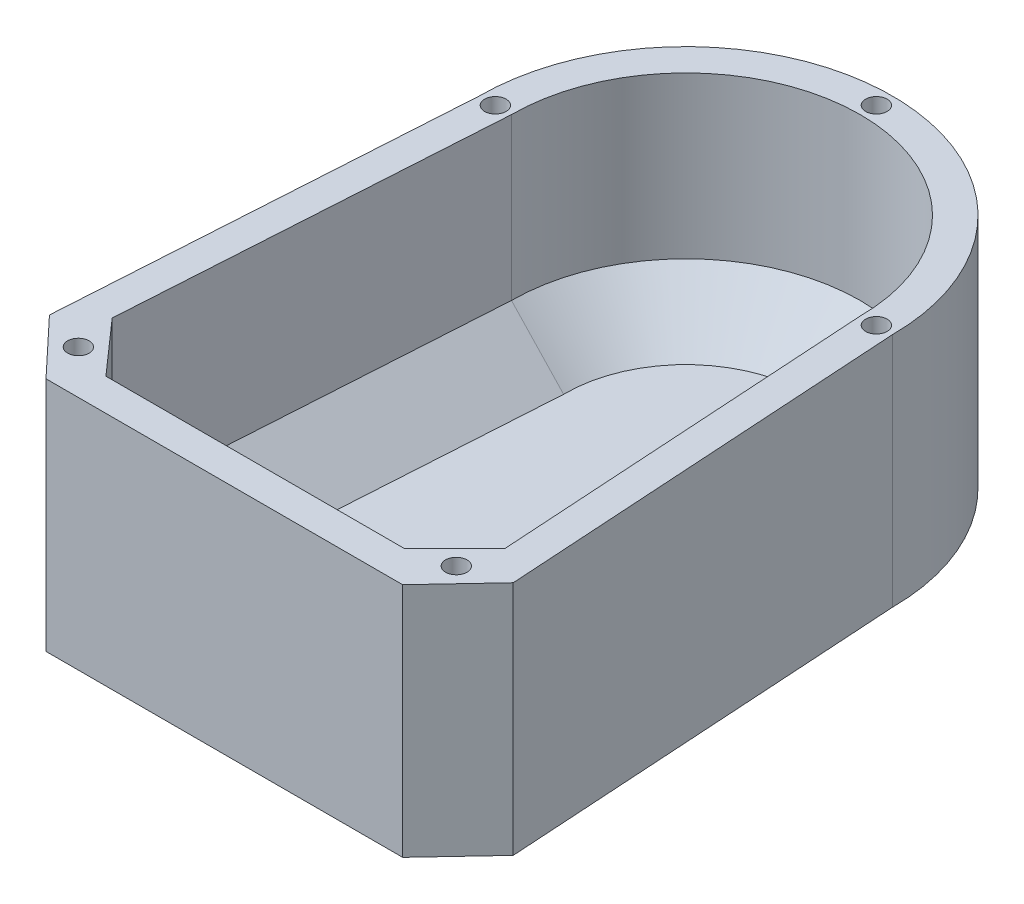
ISO-10303-21;
HEADER;
FILE_DESCRIPTION(('STEP AP214'),'2;1');
FILE_NAME('part.step','',(''),(''),'','','');
FILE_SCHEMA(('AUTOMOTIVE_DESIGN { 1 0 10303 214 1 1 1 1 }'));
ENDSEC;
DATA;
#1=APPLICATION_CONTEXT('core data for automotive mechanical design processes');
#2=APPLICATION_PROTOCOL_DEFINITION('international standard','automotive_design',2000,#1);
#3=PRODUCT_CONTEXT('',#1,'mechanical');
#4=PRODUCT('Part','Part','',(#3));
#5=PRODUCT_RELATED_PRODUCT_CATEGORY('part','',(#4));
#6=PRODUCT_DEFINITION_FORMATION('','',#4);
#7=PRODUCT_DEFINITION_CONTEXT('part definition',#1,'design');
#8=PRODUCT_DEFINITION('design','',#6,#7);
#9=PRODUCT_DEFINITION_SHAPE('','',#8);
#10=(LENGTH_UNIT() NAMED_UNIT(*) SI_UNIT(.MILLI.,.METRE.));
#11=(NAMED_UNIT(*) PLANE_ANGLE_UNIT() SI_UNIT($,.RADIAN.));
#12=(NAMED_UNIT(*) SI_UNIT($,.STERADIAN.) SOLID_ANGLE_UNIT());
#13=UNCERTAINTY_MEASURE_WITH_UNIT(LENGTH_MEASURE(1.E-05),#10,'distance_accuracy_value','');
#14=(GEOMETRIC_REPRESENTATION_CONTEXT(3) GLOBAL_UNCERTAINTY_ASSIGNED_CONTEXT((#13)) GLOBAL_UNIT_ASSIGNED_CONTEXT((#10,
#11,#12)) REPRESENTATION_CONTEXT('',''));
#15=CARTESIAN_POINT('',(0.,0.,0.));
#16=DIRECTION('',(0.,0.,1.));
#17=DIRECTION('',(1.,0.,0.));
#18=AXIS2_PLACEMENT_3D('',#15,#16,#17);
#19=CARTESIAN_POINT('',(0.,4.,0.));
#20=DIRECTION('',(0.,1.,0.));
#21=DIRECTION('',(0.,0.,1.));
#22=AXIS2_PLACEMENT_3D('',#19,#20,#21);
#23=PLANE('',#22);
#24=DIRECTION('',(1.,0.,0.));
#25=VECTOR('',#24,1.);
#26=CARTESIAN_POINT('',(0.,4.,70.));
#27=LINE('',#26,#25);
#28=CARTESIAN_POINT('',(-26.8554877863241,4.,70.));
#29=VERTEX_POINT('',#28);
#30=CARTESIAN_POINT('',(26.8554877863241,4.,70.));
#31=VERTEX_POINT('',#30);
#32=EDGE_CURVE('E212',#29,#31,#27,.T.);
#33=ORIENTED_EDGE('',*,*,#32,.T.);
#34=DIRECTION('',(-0.0623782861551806,0.,-0.998052578482889));
#35=VECTOR('',#34,1.);
#36=CARTESIAN_POINT('',(22.3930150712022,4.,-1.39956344195014));
#37=LINE('',#36,#35);
#38=CARTESIAN_POINT('',(22.498212646903,4.,0.283597769262948));
#39=VERTEX_POINT('',#38);
#40=EDGE_CURVE('E214',#31,#39,#37,.T.);
#41=ORIENTED_EDGE('',*,*,#40,.T.);
#42=CARTESIAN_POINT('',(0.,4.,0.));
#43=DIRECTION('',(0.,1.,0.));
#44=DIRECTION('',(0.,0.,1.));
#45=AXIS2_PLACEMENT_3D('',#42,#43,#44);
#46=CIRCLE('',#45,22.5);
#47=CARTESIAN_POINT('',(-22.498212646903,4.,0.283597769262998));
#48=VERTEX_POINT('',#47);
#49=EDGE_CURVE('E206',#39,#48,#46,.T.);
#50=ORIENTED_EDGE('',*,*,#49,.T.);
#51=DIRECTION('',(-0.0623782861551804,0.,0.998052578482889));
#52=VECTOR('',#51,1.);
#53=CARTESIAN_POINT('',(-22.3930150712022,4.,-1.39956344195013));
#54=LINE('',#53,#52);
#55=EDGE_CURVE('E210',#48,#29,#54,.T.);
#56=ORIENTED_EDGE('',*,*,#55,.T.);
#57=EDGE_LOOP('',(#33,#41,#50,#56));
#58=FACE_BOUND('',#57,.T.);
#59=ADVANCED_FACE('F39',(#58),#23,.T.);
#60=CARTESIAN_POINT('',(-38.5,0.,0.));
#61=DIRECTION('',(-0.998052578482888,0.,-0.0623782861551804));
#62=DIRECTION('',(-0.0623782861551804,0.,0.998052578482889));
#63=AXIS2_PLACEMENT_3D('',#60,#61,#62);
#64=PLANE('',#63);
#65=DIRECTION('',(-0.0623782861551804,0.,0.998052578482889));
#66=VECTOR('',#65,1.);
#67=CARTESIAN_POINT('',(-38.5,0.,0.));
#68=LINE('',#67,#66);
#69=CARTESIAN_POINT('',(-38.5,0.,0.));
#70=VERTEX_POINT('',#69);
#71=CARTESIAN_POINT('',(-43.211013571153,0.,75.3762171384481));
#72=VERTEX_POINT('',#71);
#73=EDGE_CURVE('E191',#70,#72,#68,.T.);
#74=ORIENTED_EDGE('',*,*,#73,.T.);
#75=DIRECTION('',(0.,1.,0.));
#76=VECTOR('',#75,1.);
#77=CARTESIAN_POINT('',(-43.211013571153,0.,75.3762171384481));
#78=LINE('',#77,#76);
#79=CARTESIAN_POINT('',(-43.211013571153,44.,75.3762171384481));
#80=VERTEX_POINT('',#79);
#81=EDGE_CURVE('E284',#72,#80,#78,.T.);
#82=ORIENTED_EDGE('',*,*,#81,.T.);
#83=DIRECTION('',(-0.0623782861551804,0.,0.998052578482889));
#84=VECTOR('',#83,1.);
#85=CARTESIAN_POINT('',(-38.5,44.,0.));
#86=LINE('',#85,#84);
#87=CARTESIAN_POINT('',(-38.5,44.,0.));
#88=VERTEX_POINT('',#87);
#89=EDGE_CURVE('E181',#88,#80,#86,.T.);
#90=ORIENTED_EDGE('',*,*,#89,.F.);
#91=DIRECTION('',(0.,1.,0.));
#92=VECTOR('',#91,1.);
#93=CARTESIAN_POINT('',(-38.5,0.,0.));
#94=LINE('',#93,#92);
#95=EDGE_CURVE('E204',#70,#88,#94,.T.);
#96=ORIENTED_EDGE('',*,*,#95,.F.);
#97=EDGE_LOOP('',(#74,#82,#90,#96));
#98=FACE_BOUND('',#97,.T.);
#99=ADVANCED_FACE('F323',(#98),#64,.T.);
#100=CARTESIAN_POINT('',(0.,0.,0.));
#101=DIRECTION('',(0.,1.,0.));
#102=DIRECTION('',(0.,0.,1.));
#103=AXIS2_PLACEMENT_3D('',#100,#101,#102);
#104=CYLINDRICAL_SURFACE('',#103,38.5);
#105=ORIENTED_EDGE('',*,*,#95,.T.);
#106=CARTESIAN_POINT('',(0.,44.,0.));
#107=DIRECTION('',(0.,1.,0.));
#108=DIRECTION('',(0.,0.,1.));
#109=AXIS2_PLACEMENT_3D('',#106,#107,#108);
#110=CIRCLE('',#109,38.5);
#111=CARTESIAN_POINT('',(38.5,44.,0.));
#112=VERTEX_POINT('',#111);
#113=EDGE_CURVE('E160',#112,#88,#110,.T.);
#114=ORIENTED_EDGE('',*,*,#113,.F.);
#115=DIRECTION('',(0.,1.,0.));
#116=VECTOR('',#115,1.);
#117=CARTESIAN_POINT('',(38.5,0.,0.));
#118=LINE('',#117,#116);
#119=CARTESIAN_POINT('',(38.5,0.,0.));
#120=VERTEX_POINT('',#119);
#121=EDGE_CURVE('E203',#120,#112,#118,.T.);
#122=ORIENTED_EDGE('',*,*,#121,.F.);
#123=CARTESIAN_POINT('',(0.,0.,0.));
#124=DIRECTION('',(0.,1.,0.));
#125=DIRECTION('',(0.,0.,1.));
#126=AXIS2_PLACEMENT_3D('',#123,#124,#125);
#127=CIRCLE('',#126,38.5);
#128=EDGE_CURVE('E200',#120,#70,#127,.T.);
#129=ORIENTED_EDGE('',*,*,#128,.T.);
#130=EDGE_LOOP('',(#105,#114,#122,#129));
#131=FACE_BOUND('',#130,.T.);
#132=ADVANCED_FACE('F329',(#131),#104,.T.);
#133=CARTESIAN_POINT('',(43.5,0.,80.));
#134=DIRECTION('',(0.998052578482888,0.,-0.0623782861551807));
#135=DIRECTION('',(-0.0623782861551807,0.,-0.998052578482889));
#136=AXIS2_PLACEMENT_3D('',#133,#134,#135);
#137=PLANE('',#136);
#138=DIRECTION('',(-0.0623782861551807,0.,-0.998052578482889));
#139=VECTOR('',#138,1.);
#140=CARTESIAN_POINT('',(43.5,44.,80.));
#141=LINE('',#140,#139);
#142=CARTESIAN_POINT('',(43.211013571153,44.,75.3762171384481));
#143=VERTEX_POINT('',#142);
#144=EDGE_CURVE('E187',#143,#112,#141,.T.);
#145=ORIENTED_EDGE('',*,*,#144,.F.);
#146=DIRECTION('',(0.,-1.,0.));
#147=VECTOR('',#146,1.);
#148=CARTESIAN_POINT('',(43.211013571153,0.,75.3762171384481));
#149=LINE('',#148,#147);
#150=CARTESIAN_POINT('',(43.211013571153,0.,75.3762171384481));
#151=VERTEX_POINT('',#150);
#152=EDGE_CURVE('E278',#143,#151,#149,.T.);
#153=ORIENTED_EDGE('',*,*,#152,.T.);
#154=DIRECTION('',(-0.0623782861551807,0.,-0.998052578482889));
#155=VECTOR('',#154,1.);
#156=CARTESIAN_POINT('',(43.5,0.,80.));
#157=LINE('',#156,#155);
#158=EDGE_CURVE('E198',#151,#120,#157,.T.);
#159=ORIENTED_EDGE('',*,*,#158,.T.);
#160=ORIENTED_EDGE('',*,*,#121,.T.);
#161=EDGE_LOOP('',(#145,#153,#159,#160));
#162=FACE_BOUND('',#161,.T.);
#163=ADVANCED_FACE('F362',(#162),#137,.T.);
#164=CARTESIAN_POINT('',(-43.5,0.,86.));
#165=DIRECTION('',(0.,0.,1.));
#166=DIRECTION('',(1.,0.,0.));
#167=AXIS2_PLACEMENT_3D('',#164,#165,#166);
#168=PLANE('',#167);
#169=DIRECTION('',(1.,0.,0.));
#170=VECTOR('',#169,1.);
#171=CARTESIAN_POINT('',(-43.5,0.,86.));
#172=LINE('',#171,#170);
#173=CARTESIAN_POINT('',(-33.2304877863241,0.,86.));
#174=VERTEX_POINT('',#173);
#175=CARTESIAN_POINT('',(33.230487786324,0.,86.));
#176=VERTEX_POINT('',#175);
#177=EDGE_CURVE('E195',#174,#176,#172,.T.);
#178=ORIENTED_EDGE('',*,*,#177,.T.);
#179=DIRECTION('',(0.,1.,0.));
#180=VECTOR('',#179,1.);
#181=CARTESIAN_POINT('',(33.230487786324,0.,86.));
#182=LINE('',#181,#180);
#183=CARTESIAN_POINT('',(33.230487786324,44.,86.));
#184=VERTEX_POINT('',#183);
#185=EDGE_CURVE('E271',#176,#184,#182,.T.);
#186=ORIENTED_EDGE('',*,*,#185,.T.);
#187=DIRECTION('',(1.,0.,0.));
#188=VECTOR('',#187,1.);
#189=CARTESIAN_POINT('',(-43.5,44.,86.));
#190=LINE('',#189,#188);
#191=CARTESIAN_POINT('',(-33.2304877863241,44.,86.));
#192=VERTEX_POINT('',#191);
#193=EDGE_CURVE('E184',#192,#184,#190,.T.);
#194=ORIENTED_EDGE('',*,*,#193,.F.);
#195=DIRECTION('',(0.,-1.,0.));
#196=VECTOR('',#195,1.);
#197=CARTESIAN_POINT('',(-33.2304877863241,0.,86.));
#198=LINE('',#197,#196);
#199=EDGE_CURVE('E225',#192,#174,#198,.T.);
#200=ORIENTED_EDGE('',*,*,#199,.T.);
#201=EDGE_LOOP('',(#178,#186,#194,#200));
#202=FACE_BOUND('',#201,.T.);
#203=ADVANCED_FACE('F352',(#202),#168,.T.);
#204=CARTESIAN_POINT('',(0.,0.,0.));
#205=DIRECTION('',(0.,1.,0.));
#206=DIRECTION('',(0.,0.,1.));
#207=AXIS2_PLACEMENT_3D('',#204,#205,#206);
#208=CYLINDRICAL_SURFACE('',#207,32.5);
#209=DIRECTION('',(0.,1.,0.));
#210=VECTOR('',#209,1.);
#211=CARTESIAN_POINT('',(-32.5,0.,0.));
#212=LINE('',#211,#210);
#213=CARTESIAN_POINT('',(-32.5,14.,0.));
#214=VERTEX_POINT('',#213);
#215=CARTESIAN_POINT('',(-32.5,44.,0.));
#216=VERTEX_POINT('',#215);
#217=EDGE_CURVE('E149',#214,#216,#212,.T.);
#218=ORIENTED_EDGE('',*,*,#217,.F.);
#219=CARTESIAN_POINT('',(0.,14.,0.));
#220=DIRECTION('',(0.,1.,0.));
#221=DIRECTION('',(0.,0.,1.));
#222=AXIS2_PLACEMENT_3D('',#219,#220,#221);
#223=CIRCLE('',#222,32.5);
#224=CARTESIAN_POINT('',(32.5,14.,0.));
#225=VERTEX_POINT('',#224);
#226=EDGE_CURVE('E223',#214,#225,#223,.F.);
#227=ORIENTED_EDGE('',*,*,#226,.T.);
#228=DIRECTION('',(0.,1.,0.));
#229=VECTOR('',#228,1.);
#230=CARTESIAN_POINT('',(32.5,0.,0.));
#231=LINE('',#230,#229);
#232=CARTESIAN_POINT('',(32.5,44.,0.));
#233=VERTEX_POINT('',#232);
#234=EDGE_CURVE('E159',#225,#233,#231,.T.);
#235=ORIENTED_EDGE('',*,*,#234,.T.);
#236=CARTESIAN_POINT('',(0.,44.,0.));
#237=DIRECTION('',(0.,1.,0.));
#238=DIRECTION('',(0.,0.,1.));
#239=AXIS2_PLACEMENT_3D('',#236,#237,#238);
#240=CIRCLE('',#239,32.5);
#241=EDGE_CURVE('E164',#233,#216,#240,.T.);
#242=ORIENTED_EDGE('',*,*,#241,.T.);
#243=EDGE_LOOP('',(#218,#227,#235,#242));
#244=FACE_BOUND('',#243,.T.);
#245=ADVANCED_FACE('F165',(#244),#208,.F.);
#246=CARTESIAN_POINT('',(37.5,0.,80.));
#247=DIRECTION('',(0.998052578482888,0.,-0.0623782861551806));
#248=DIRECTION('',(-0.0623782861551806,0.,-0.998052578482889));
#249=AXIS2_PLACEMENT_3D('',#246,#247,#248);
#250=PLANE('',#249);
#251=DIRECTION('',(0.0623782861551806,0.,0.998052578482889));
#252=VECTOR('',#251,1.);
#253=CARTESIAN_POINT('',(37.5,14.,80.));
#254=LINE('',#253,#252);
#255=CARTESIAN_POINT('',(36.9117647058824,14.,70.5882352941176));
#256=VERTEX_POINT('',#255);
#257=EDGE_CURVE('E217',#225,#256,#254,.T.);
#258=ORIENTED_EDGE('',*,*,#257,.T.);
#259=DIRECTION('',(0.,1.,0.));
#260=VECTOR('',#259,1.);
#261=CARTESIAN_POINT('',(36.9117647058824,44.,70.5882352941176));
#262=LINE('',#261,#260);
#263=CARTESIAN_POINT('',(36.9117647058824,44.,70.5882352941176));
#264=VERTEX_POINT('',#263);
#265=EDGE_CURVE('E299',#256,#264,#262,.T.);
#266=ORIENTED_EDGE('',*,*,#265,.T.);
#267=DIRECTION('',(-0.0623782861551806,0.,-0.998052578482889));
#268=VECTOR('',#267,1.);
#269=CARTESIAN_POINT('',(37.5,44.,80.));
#270=LINE('',#269,#268);
#271=EDGE_CURVE('E176',#264,#233,#270,.T.);
#272=ORIENTED_EDGE('',*,*,#271,.T.);
#273=ORIENTED_EDGE('',*,*,#234,.F.);
#274=EDGE_LOOP('',(#258,#266,#272,#273));
#275=FACE_BOUND('',#274,.T.);
#276=ADVANCED_FACE('F304',(#275),#250,.F.);
#277=CARTESIAN_POINT('',(-37.5,0.,80.));
#278=DIRECTION('',(0.,0.,1.));
#279=DIRECTION('',(1.,0.,0.));
#280=AXIS2_PLACEMENT_3D('',#277,#278,#279);
#281=PLANE('',#280);
#282=DIRECTION('',(-1.,0.,0.));
#283=VECTOR('',#282,1.);
#284=CARTESIAN_POINT('',(-37.5,14.,80.));
#285=LINE('',#284,#283);
#286=CARTESIAN_POINT('',(27.5,14.,80.));
#287=VERTEX_POINT('',#286);
#288=CARTESIAN_POINT('',(-28.0698708577168,14.,80.));
#289=VERTEX_POINT('',#288);
#290=EDGE_CURVE('E219',#287,#289,#285,.T.);
#291=ORIENTED_EDGE('',*,*,#290,.T.);
#292=DIRECTION('',(0.,1.,0.));
#293=VECTOR('',#292,1.);
#294=CARTESIAN_POINT('',(-28.0698708577168,44.,80.));
#295=LINE('',#294,#293);
#296=CARTESIAN_POINT('',(-28.0698708577168,44.,80.));
#297=VERTEX_POINT('',#296);
#298=EDGE_CURVE('E289',#289,#297,#295,.T.);
#299=ORIENTED_EDGE('',*,*,#298,.T.);
#300=DIRECTION('',(1.,0.,0.));
#301=VECTOR('',#300,1.);
#302=CARTESIAN_POINT('',(-37.5,44.,80.));
#303=LINE('',#302,#301);
#304=CARTESIAN_POINT('',(27.5,44.,80.));
#305=VERTEX_POINT('',#304);
#306=EDGE_CURVE('E173',#297,#305,#303,.T.);
#307=ORIENTED_EDGE('',*,*,#306,.T.);
#308=DIRECTION('',(0.,-1.,0.));
#309=VECTOR('',#308,1.);
#310=CARTESIAN_POINT('',(27.5,14.,80.));
#311=LINE('',#310,#309);
#312=EDGE_CURVE('E287',#305,#287,#311,.T.);
#313=ORIENTED_EDGE('',*,*,#312,.T.);
#314=EDGE_LOOP('',(#291,#299,#307,#313));
#315=FACE_BOUND('',#314,.T.);
#316=ADVANCED_FACE('F308',(#315),#281,.F.);
#317=CARTESIAN_POINT('',(-32.5,0.,0.));
#318=DIRECTION('',(-0.998052578482888,0.,-0.0623782861551804));
#319=DIRECTION('',(-0.0623782861551804,0.,0.998052578482889));
#320=AXIS2_PLACEMENT_3D('',#317,#318,#319);
#321=PLANE('',#320);
#322=DIRECTION('',(-0.0623782861551804,0.,0.998052578482889));
#323=VECTOR('',#322,1.);
#324=CARTESIAN_POINT('',(-32.5,44.,0.));
#325=LINE('',#324,#323);
#326=CARTESIAN_POINT('',(-36.8762171384482,44.,70.0194742151712));
#327=VERTEX_POINT('',#326);
#328=EDGE_CURVE('E153',#216,#327,#325,.T.);
#329=ORIENTED_EDGE('',*,*,#328,.T.);
#330=DIRECTION('',(0.,-1.,0.));
#331=VECTOR('',#330,1.);
#332=CARTESIAN_POINT('',(-36.8762171384482,14.,70.0194742151712));
#333=LINE('',#332,#331);
#334=CARTESIAN_POINT('',(-36.8762171384482,14.,70.0194742151712));
#335=VERTEX_POINT('',#334);
#336=EDGE_CURVE('E292',#327,#335,#333,.T.);
#337=ORIENTED_EDGE('',*,*,#336,.T.);
#338=DIRECTION('',(0.0623782861551804,0.,-0.998052578482889));
#339=VECTOR('',#338,1.);
#340=CARTESIAN_POINT('',(-32.5,14.,0.));
#341=LINE('',#340,#339);
#342=EDGE_CURVE('E156',#335,#214,#341,.T.);
#343=ORIENTED_EDGE('',*,*,#342,.T.);
#344=ORIENTED_EDGE('',*,*,#217,.T.);
#345=EDGE_LOOP('',(#329,#337,#343,#344));
#346=FACE_BOUND('',#345,.T.);
#347=ADVANCED_FACE('F151',(#346),#321,.F.);
#348=CARTESIAN_POINT('',(0.,44.,0.));
#349=DIRECTION('',(0.,1.,0.));
#350=DIRECTION('',(0.,0.,1.));
#351=AXIS2_PLACEMENT_3D('',#348,#349,#350);
#352=PLANE('',#351);
#353=CARTESIAN_POINT('',(0.,44.,-35.5));
#354=DIRECTION('',(0.,1.,0.));
#355=DIRECTION('',(0.,0.,1.));
#356=AXIS2_PLACEMENT_3D('',#353,#354,#355);
#357=CIRCLE('',#356,2.);
#358=CARTESIAN_POINT('',(0.,44.,-33.5));
#359=VERTEX_POINT('',#358);
#360=EDGE_CURVE('E417',#359,#359,#357,.T.);
#361=ORIENTED_EDGE('',*,*,#360,.F.);
#362=EDGE_LOOP('',(#361));
#363=FACE_BOUND('',#362,.T.);
#364=CARTESIAN_POINT('',(-35.5,44.,0.));
#365=DIRECTION('',(0.,1.,0.));
#366=DIRECTION('',(0.,0.,1.));
#367=AXIS2_PLACEMENT_3D('',#364,#365,#366);
#368=CIRCLE('',#367,2.);
#369=CARTESIAN_POINT('',(-35.5,44.,2.));
#370=VERTEX_POINT('',#369);
#371=EDGE_CURVE('E420',#370,#370,#368,.T.);
#372=ORIENTED_EDGE('',*,*,#371,.F.);
#373=EDGE_LOOP('',(#372));
#374=FACE_BOUND('',#373,.T.);
#375=CARTESIAN_POINT('',(-35.3468973384105,44.,77.8489228384048));
#376=DIRECTION('',(0.,1.,0.));
#377=DIRECTION('',(0.,0.,1.));
#378=AXIS2_PLACEMENT_3D('',#375,#376,#377);
#379=CIRCLE('',#378,2.);
#380=CARTESIAN_POINT('',(-35.3468973384105,44.,79.8489228384048));
#381=VERTEX_POINT('',#380);
#382=EDGE_CURVE('E428',#381,#381,#379,.T.);
#383=ORIENTED_EDGE('',*,*,#382,.F.);
#384=EDGE_LOOP('',(#383));
#385=FACE_BOUND('',#384,.T.);
#386=CARTESIAN_POINT('',(35.2133165158398,44.,77.9911131081414));
#387=DIRECTION('',(0.,1.,0.));
#388=DIRECTION('',(0.,0.,1.));
#389=AXIS2_PLACEMENT_3D('',#386,#387,#388);
#390=CIRCLE('',#389,2.);
#391=CARTESIAN_POINT('',(35.2133165158398,44.,79.9911131081414));
#392=VERTEX_POINT('',#391);
#393=EDGE_CURVE('E434',#392,#392,#390,.T.);
#394=ORIENTED_EDGE('',*,*,#393,.F.);
#395=EDGE_LOOP('',(#394));
#396=FACE_BOUND('',#395,.T.);
#397=CARTESIAN_POINT('',(35.5,44.,0.));
#398=DIRECTION('',(0.,1.,0.));
#399=DIRECTION('',(0.,0.,1.));
#400=AXIS2_PLACEMENT_3D('',#397,#398,#399);
#401=CIRCLE('',#400,2.);
#402=CARTESIAN_POINT('',(35.5,44.,2.));
#403=VERTEX_POINT('',#402);
#404=EDGE_CURVE('E440',#403,#403,#401,.T.);
#405=ORIENTED_EDGE('',*,*,#404,.F.);
#406=EDGE_LOOP('',(#405));
#407=FACE_BOUND('',#406,.T.);
#408=ORIENTED_EDGE('',*,*,#193,.T.);
#409=DIRECTION('',(-0.684697639051293,0.,0.728827238155645));
#410=VECTOR('',#409,1.);
#411=CARTESIAN_POINT('',(60.5679352060318,44.,56.90062070502));
#412=LINE('',#411,#410);
#413=EDGE_CURVE('E276',#184,#143,#412,.F.);
#414=ORIENTED_EDGE('',*,*,#413,.T.);
#415=ORIENTED_EDGE('',*,*,#144,.T.);
#416=ORIENTED_EDGE('',*,*,#113,.T.);
#417=ORIENTED_EDGE('',*,*,#89,.T.);
#418=DIRECTION('',(-0.684697639051286,0.,-0.728827238155652));
#419=VECTOR('',#418,1.);
#420=CARTESIAN_POINT('',(-60.5679352060322,44.,56.9006207050192));
#421=LINE('',#420,#419);
#422=EDGE_CURVE('E274',#80,#192,#421,.F.);
#423=ORIENTED_EDGE('',*,*,#422,.T.);
#424=EDGE_LOOP('',(#408,#414,#415,#416,#417,#423));
#425=FACE_BOUND('',#424,.T.);
#426=ORIENTED_EDGE('',*,*,#328,.F.);
#427=ORIENTED_EDGE('',*,*,#241,.F.);
#428=ORIENTED_EDGE('',*,*,#271,.F.);
#429=DIRECTION('',(0.707106781186544,0.,-0.707106781186551));
#430=VECTOR('',#429,1.);
#431=CARTESIAN_POINT('',(36.9117647058824,44.,70.5882352941176));
#432=LINE('',#431,#430);
#433=EDGE_CURVE('E11',#264,#305,#432,.F.);
#434=ORIENTED_EDGE('',*,*,#433,.T.);
#435=ORIENTED_EDGE('',*,*,#306,.F.);
#436=DIRECTION('',(0.661621637086851,0.,0.749837855365089));
#437=VECTOR('',#436,1.);
#438=CARTESIAN_POINT('',(-28.0698708577168,44.,80.));
#439=LINE('',#438,#437);
#440=EDGE_CURVE('E48',#297,#327,#439,.F.);
#441=ORIENTED_EDGE('',*,*,#440,.T.);
#442=EDGE_LOOP('',(#426,#427,#428,#434,#435,#441));
#443=FACE_BOUND('',#442,.T.);
#444=ADVANCED_FACE('F171',(#363,#374,#385,#396,#407,#425,#443),#352,.T.);
#445=CARTESIAN_POINT('',(0.,0.,0.));
#446=DIRECTION('',(0.,1.,0.));
#447=DIRECTION('',(0.,0.,1.));
#448=AXIS2_PLACEMENT_3D('',#445,#446,#447);
#449=PLANE('',#448);
#450=ORIENTED_EDGE('',*,*,#158,.F.);
#451=DIRECTION('',(0.684697639051293,0.,-0.728827238155645));
#452=VECTOR('',#451,1.);
#453=CARTESIAN_POINT('',(33.230487786324,0.,86.));
#454=LINE('',#453,#452);
#455=EDGE_CURVE('E282',#151,#176,#454,.F.);
#456=ORIENTED_EDGE('',*,*,#455,.T.);
#457=ORIENTED_EDGE('',*,*,#177,.F.);
#458=DIRECTION('',(0.684697639051286,0.,0.728827238155652));
#459=VECTOR('',#458,1.);
#460=CARTESIAN_POINT('',(-43.211013571153,0.,75.376217138448));
#461=LINE('',#460,#459);
#462=EDGE_CURVE('E280',#174,#72,#461,.F.);
#463=ORIENTED_EDGE('',*,*,#462,.T.);
#464=ORIENTED_EDGE('',*,*,#73,.F.);
#465=ORIENTED_EDGE('',*,*,#128,.F.);
#466=EDGE_LOOP('',(#450,#456,#457,#463,#464,#465));
#467=FACE_BOUND('',#466,.T.);
#468=ADVANCED_FACE('F258',(#467),#449,.F.);
#469=CARTESIAN_POINT('',(-22.3930150712022,4.,-1.39956344195013));
#470=DIRECTION('',(-0.705729746225966,-0.707106781186551,-0.0441081091391228));
#471=DIRECTION('',(-0.0623782861551804,0.,0.998052578482889));
#472=AXIS2_PLACEMENT_3D('',#469,#470,#471);
#473=PLANE('',#472);
#474=ORIENTED_EDGE('',*,*,#342,.F.);
#475=DIRECTION('',(-0.540211804549219,0.577350269189624,-0.612240045155775));
#476=VECTOR('',#475,1.);
#477=CARTESIAN_POINT('',(-26.6388395870979,3.05882352941177,81.6218354400347));
#478=LINE('',#477,#476);
#479=CARTESIAN_POINT('',(-32.343902290593,9.15609770940698,75.156097709407));
#480=VERTEX_POINT('',#479);
#481=EDGE_CURVE('E294',#335,#480,#478,.F.);
#482=ORIENTED_EDGE('',*,*,#481,.T.);
#483=DIRECTION('',(0.601369860027895,-0.564957649496856,-0.564957649496861));
#484=VECTOR('',#483,1.);
#485=CARTESIAN_POINT('',(-17.1433158773838,-5.12411176198579,60.8758882380141));
#486=LINE('',#485,#484);
#487=EDGE_CURVE('E169',#29,#480,#486,.F.);
#488=ORIENTED_EDGE('',*,*,#487,.F.);
#489=ORIENTED_EDGE('',*,*,#55,.F.);
#490=CARTESIAN_POINT('',(-32.5,14.,0.));
#491=CARTESIAN_POINT('',(-30.8332717271832,12.333245083595,0.0524616223290177));
#492=CARTESIAN_POINT('',(-29.1664254963513,10.6665344769914,0.102325576263697));
#493=CARTESIAN_POINT('',(-25.832496378757,7.33320114361872,0.196858168324026));
#494=CARTESIAN_POINT('',(-24.1654134918899,5.66657841688904,0.241526804143667));
#495=CARTESIAN_POINT('',(-22.498212646903,4.,0.28359776926296));
#496=B_SPLINE_CURVE_WITH_KNOTS('',3,(#490,#491,#492,#493,#494,#495),.UNSPECIFIED.,.F.,.F.,(4,2,
4),(0.,7.07312400257139,14.1462511446257),.UNSPECIFIED.);
#497=EDGE_CURVE('E261',#214,#48,#496,.T.);
#498=ORIENTED_EDGE('',*,*,#497,.F.);
#499=EDGE_LOOP('',(#474,#482,#488,#489,#498));
#500=FACE_BOUND('',#499,.T.);
#501=ADVANCED_FACE('F250',(#500),#473,.F.);
#502=CARTESIAN_POINT('',(0.,4.,70.));
#503=DIRECTION('',(0.,-0.707106781186551,0.707106781186544));
#504=DIRECTION('',(1.,0.,0.));
#505=AXIS2_PLACEMENT_3D('',#502,#503,#504);
#506=PLANE('',#505);
#507=ORIENTED_EDGE('',*,*,#487,.T.);
#508=DIRECTION('',(-0.529338504930445,-0.599916972254492,-0.599916972254498));
#509=VECTOR('',#508,1.);
#510=CARTESIAN_POINT('',(-32.515699002175,8.96139476961401,74.961394769614));
#511=LINE('',#510,#509);
#512=EDGE_CURVE('E297',#480,#289,#511,.F.);
#513=ORIENTED_EDGE('',*,*,#512,.T.);
#514=ORIENTED_EDGE('',*,*,#290,.F.);
#515=DIRECTION('',(-0.577350269189624,0.577350269189624,0.57735026918963));
#516=VECTOR('',#515,1.);
#517=CARTESIAN_POINT('',(38.4411764705882,3.05882352941176,69.0588235294117));
#518=LINE('',#517,#516);
#519=CARTESIAN_POINT('',(32.343902290593,9.15609770940698,75.156097709407));
#520=VERTEX_POINT('',#519);
#521=EDGE_CURVE('E63',#287,#520,#518,.F.);
#522=ORIENTED_EDGE('',*,*,#521,.T.);
#523=DIRECTION('',(-0.601369860027895,-0.564957649496856,-0.564957649496861));
#524=VECTOR('',#523,1.);
#525=CARTESIAN_POINT('',(0.983758913710109,-20.305227288268,45.6947727117317));
#526=LINE('',#525,#524);
#527=EDGE_CURVE('E234',#31,#520,#526,.F.);
#528=ORIENTED_EDGE('',*,*,#527,.F.);
#529=ORIENTED_EDGE('',*,*,#32,.F.);
#530=EDGE_LOOP('',(#507,#513,#514,#522,#528,#529));
#531=FACE_BOUND('',#530,.T.);
#532=ADVANCED_FACE('F257',(#531),#506,.F.);
#533=CARTESIAN_POINT('',(0.,4.,0.));
#534=DIRECTION('',(0.,1.,0.));
#535=DIRECTION('',(0.,0.,1.));
#536=AXIS2_PLACEMENT_3D('',#533,#534,#535);
#537=CONICAL_SURFACE('',#536,22.5,0.785398163397453);
#538=ORIENTED_EDGE('',*,*,#497,.T.);
#539=ORIENTED_EDGE('',*,*,#49,.F.);
#540=CARTESIAN_POINT('',(22.498212646903,4.,0.283597769262948));
#541=CARTESIAN_POINT('',(24.1654134918899,5.66657841688904,0.24152680414364));
#542=CARTESIAN_POINT('',(25.832496378757,7.33320114361871,0.19685816832399));
#543=CARTESIAN_POINT('',(29.1664254963513,10.6665344769914,0.102325576263657));
#544=CARTESIAN_POINT('',(30.8332717271832,12.333245083595,0.0524616223289828));
#545=CARTESIAN_POINT('',(32.5,14.,0.));
#546=B_SPLINE_CURVE_WITH_KNOTS('',3,(#540,#541,#542,#543,#544,#545),.UNSPECIFIED.,.F.,.F.,(4,2,
4),(0.,7.07312714205432,14.1462511446257),.UNSPECIFIED.);
#547=EDGE_CURVE('E226',#225,#39,#546,.F.);
#548=ORIENTED_EDGE('',*,*,#547,.F.);
#549=ORIENTED_EDGE('',*,*,#226,.F.);
#550=EDGE_LOOP('',(#538,#539,#548,#549));
#551=FACE_BOUND('',#550,.T.);
#552=ADVANCED_FACE('F238',(#551),#537,.F.);
#553=CARTESIAN_POINT('',(22.3930150712022,4.,-1.39956344195014));
#554=DIRECTION('',(0.705729746225966,-0.707106781186551,-0.0441081091391229));
#555=DIRECTION('',(-0.0623782861551806,0.,-0.998052578482889));
#556=AXIS2_PLACEMENT_3D('',#553,#554,#555);
#557=PLANE('',#556);
#558=ORIENTED_EDGE('',*,*,#527,.T.);
#559=DIRECTION('',(-0.565729452300742,-0.599916972254492,0.565729452300748));
#560=VECTOR('',#559,1.);
#561=CARTESIAN_POINT('',(32.16029490393,8.961394769614,75.33970509607));
#562=LINE('',#561,#560);
#563=EDGE_CURVE('E55',#520,#256,#562,.F.);
#564=ORIENTED_EDGE('',*,*,#563,.T.);
#565=ORIENTED_EDGE('',*,*,#257,.F.);
#566=ORIENTED_EDGE('',*,*,#547,.T.);
#567=ORIENTED_EDGE('',*,*,#40,.F.);
#568=EDGE_LOOP('',(#558,#564,#565,#566,#567));
#569=FACE_BOUND('',#568,.T.);
#570=ADVANCED_FACE('F242',(#569),#557,.F.);
#571=CARTESIAN_POINT('',(33.230487786324,0.,86.));
#572=DIRECTION('',(-0.728827238155645,0.,-0.684697639051293));
#573=DIRECTION('',(0.,1.,0.));
#574=AXIS2_PLACEMENT_3D('',#571,#572,#573);
#575=PLANE('',#574);
#576=ORIENTED_EDGE('',*,*,#455,.F.);
#577=ORIENTED_EDGE('',*,*,#152,.F.);
#578=ORIENTED_EDGE('',*,*,#413,.F.);
#579=ORIENTED_EDGE('',*,*,#185,.F.);
#580=EDGE_LOOP('',(#576,#577,#578,#579));
#581=FACE_BOUND('',#580,.T.);
#582=ADVANCED_FACE('F249',(#581),#575,.F.);
#583=CARTESIAN_POINT('',(-43.211013571153,0.,75.376217138448));
#584=DIRECTION('',(0.728827238155652,0.,-0.684697639051286));
#585=DIRECTION('',(0.,1.,0.));
#586=AXIS2_PLACEMENT_3D('',#583,#584,#585);
#587=PLANE('',#586);
#588=ORIENTED_EDGE('',*,*,#462,.F.);
#589=ORIENTED_EDGE('',*,*,#199,.F.);
#590=ORIENTED_EDGE('',*,*,#422,.F.);
#591=ORIENTED_EDGE('',*,*,#81,.F.);
#592=EDGE_LOOP('',(#588,#589,#590,#591));
#593=FACE_BOUND('',#592,.T.);
#594=ADVANCED_FACE('F320',(#593),#587,.F.);
#595=CARTESIAN_POINT('',(-28.0698708577168,0.,80.));
#596=DIRECTION('',(0.749837855365089,0.,-0.66162163708685));
#597=DIRECTION('',(0.,-1.,0.));
#598=AXIS2_PLACEMENT_3D('',#595,#596,#597);
#599=PLANE('',#598);
#600=ORIENTED_EDGE('',*,*,#481,.F.);
#601=ORIENTED_EDGE('',*,*,#336,.F.);
#602=ORIENTED_EDGE('',*,*,#440,.F.);
#603=ORIENTED_EDGE('',*,*,#298,.F.);
#604=ORIENTED_EDGE('',*,*,#512,.F.);
#605=EDGE_LOOP('',(#600,#601,#602,#603,#604));
#606=FACE_BOUND('',#605,.T.);
#607=ADVANCED_FACE('F312',(#606),#599,.T.);
#608=CARTESIAN_POINT('',(36.9117647058824,0.,70.5882352941176));
#609=DIRECTION('',(-0.707106781186551,0.,-0.707106781186544));
#610=DIRECTION('',(0.,-1.,0.));
#611=AXIS2_PLACEMENT_3D('',#608,#609,#610);
#612=PLANE('',#611);
#613=ORIENTED_EDGE('',*,*,#521,.F.);
#614=ORIENTED_EDGE('',*,*,#312,.F.);
#615=ORIENTED_EDGE('',*,*,#433,.F.);
#616=ORIENTED_EDGE('',*,*,#265,.F.);
#617=ORIENTED_EDGE('',*,*,#563,.F.);
#618=EDGE_LOOP('',(#613,#614,#615,#616,#617));
#619=FACE_BOUND('',#618,.T.);
#620=ADVANCED_FACE('F42',(#619),#612,.T.);
#621=CARTESIAN_POINT('',(35.5,39.,0.));
#622=DIRECTION('',(0.,1.,0.));
#623=DIRECTION('',(0.,0.,1.));
#624=AXIS2_PLACEMENT_3D('',#621,#622,#623);
#625=CYLINDRICAL_SURFACE('',#624,2.);
#626=CARTESIAN_POINT('',(35.5,39.,0.));
#627=DIRECTION('',(0.,1.,0.));
#628=DIRECTION('',(0.,0.,1.));
#629=AXIS2_PLACEMENT_3D('',#626,#627,#628);
#630=CIRCLE('',#629,2.);
#631=CARTESIAN_POINT('',(35.5,39.,2.));
#632=VERTEX_POINT('',#631);
#633=EDGE_CURVE('E442',#632,#632,#630,.T.);
#634=ORIENTED_EDGE('',*,*,#633,.F.);
#635=EDGE_LOOP('',(#634));
#636=FACE_BOUND('',#635,.T.);
#637=ORIENTED_EDGE('',*,*,#404,.T.);
#638=EDGE_LOOP('',(#637));
#639=FACE_BOUND('',#638,.T.);
#640=ADVANCED_FACE('F311',(#636,#639),#625,.F.);
#641=CARTESIAN_POINT('',(35.5,39.,0.));
#642=DIRECTION('',(0.,1.,0.));
#643=DIRECTION('',(0.,0.,1.));
#644=AXIS2_PLACEMENT_3D('',#641,#642,#643);
#645=PLANE('',#644);
#646=ORIENTED_EDGE('',*,*,#633,.T.);
#647=EDGE_LOOP('',(#646));
#648=FACE_BOUND('',#647,.T.);
#649=ADVANCED_FACE('F317',(#648),#645,.T.);
#650=CARTESIAN_POINT('',(35.2133165158398,39.,77.9911131081414));
#651=DIRECTION('',(0.,1.,0.));
#652=DIRECTION('',(0.,0.,1.));
#653=AXIS2_PLACEMENT_3D('',#650,#651,#652);
#654=CYLINDRICAL_SURFACE('',#653,2.);
#655=CARTESIAN_POINT('',(35.2133165158398,39.,77.9911131081414));
#656=DIRECTION('',(0.,1.,0.));
#657=DIRECTION('',(0.,0.,1.));
#658=AXIS2_PLACEMENT_3D('',#655,#656,#657);
#659=CIRCLE('',#658,2.);
#660=CARTESIAN_POINT('',(35.2133165158398,39.,79.9911131081414));
#661=VERTEX_POINT('',#660);
#662=EDGE_CURVE('E437',#661,#661,#659,.T.);
#663=ORIENTED_EDGE('',*,*,#662,.F.);
#664=EDGE_LOOP('',(#663));
#665=FACE_BOUND('',#664,.T.);
#666=ORIENTED_EDGE('',*,*,#393,.T.);
#667=EDGE_LOOP('',(#666));
#668=FACE_BOUND('',#667,.T.);
#669=ADVANCED_FACE('F380',(#665,#668),#654,.F.);
#670=CARTESIAN_POINT('',(35.2133165158398,39.,77.9911131081414));
#671=DIRECTION('',(0.,1.,0.));
#672=DIRECTION('',(0.,0.,1.));
#673=AXIS2_PLACEMENT_3D('',#670,#671,#672);
#674=PLANE('',#673);
#675=ORIENTED_EDGE('',*,*,#662,.T.);
#676=EDGE_LOOP('',(#675));
#677=FACE_BOUND('',#676,.T.);
#678=ADVANCED_FACE('F383',(#677),#674,.T.);
#679=CARTESIAN_POINT('',(-35.3468973384105,39.,77.8489228384048));
#680=DIRECTION('',(0.,1.,0.));
#681=DIRECTION('',(0.,0.,1.));
#682=AXIS2_PLACEMENT_3D('',#679,#680,#681);
#683=CYLINDRICAL_SURFACE('',#682,2.);
#684=CARTESIAN_POINT('',(-35.3468973384105,39.,77.8489228384048));
#685=DIRECTION('',(0.,1.,0.));
#686=DIRECTION('',(0.,0.,1.));
#687=AXIS2_PLACEMENT_3D('',#684,#685,#686);
#688=CIRCLE('',#687,2.);
#689=CARTESIAN_POINT('',(-35.3468973384105,39.,79.8489228384048));
#690=VERTEX_POINT('',#689);
#691=EDGE_CURVE('E431',#690,#690,#688,.T.);
#692=ORIENTED_EDGE('',*,*,#691,.F.);
#693=EDGE_LOOP('',(#692));
#694=FACE_BOUND('',#693,.T.);
#695=ORIENTED_EDGE('',*,*,#382,.T.);
#696=EDGE_LOOP('',(#695));
#697=FACE_BOUND('',#696,.T.);
#698=ADVANCED_FACE('F386',(#694,#697),#683,.F.);
#699=CARTESIAN_POINT('',(-35.3468973384105,39.,77.8489228384048));
#700=DIRECTION('',(0.,1.,0.));
#701=DIRECTION('',(0.,0.,1.));
#702=AXIS2_PLACEMENT_3D('',#699,#700,#701);
#703=PLANE('',#702);
#704=ORIENTED_EDGE('',*,*,#691,.T.);
#705=EDGE_LOOP('',(#704));
#706=FACE_BOUND('',#705,.T.);
#707=ADVANCED_FACE('F391',(#706),#703,.T.);
#708=CARTESIAN_POINT('',(-35.5,39.,0.));
#709=DIRECTION('',(0.,1.,0.));
#710=DIRECTION('',(0.,0.,1.));
#711=AXIS2_PLACEMENT_3D('',#708,#709,#710);
#712=CYLINDRICAL_SURFACE('',#711,2.);
#713=CARTESIAN_POINT('',(-35.5,39.,0.));
#714=DIRECTION('',(0.,1.,0.));
#715=DIRECTION('',(0.,0.,1.));
#716=AXIS2_PLACEMENT_3D('',#713,#714,#715);
#717=CIRCLE('',#716,2.);
#718=CARTESIAN_POINT('',(-35.5,39.,2.));
#719=VERTEX_POINT('',#718);
#720=EDGE_CURVE('E425',#719,#719,#717,.T.);
#721=ORIENTED_EDGE('',*,*,#720,.F.);
#722=EDGE_LOOP('',(#721));
#723=FACE_BOUND('',#722,.T.);
#724=ORIENTED_EDGE('',*,*,#371,.T.);
#725=EDGE_LOOP('',(#724));
#726=FACE_BOUND('',#725,.T.);
#727=ADVANCED_FACE('F394',(#723,#726),#712,.F.);
#728=CARTESIAN_POINT('',(-35.5,39.,0.));
#729=DIRECTION('',(0.,1.,0.));
#730=DIRECTION('',(0.,0.,1.));
#731=AXIS2_PLACEMENT_3D('',#728,#729,#730);
#732=PLANE('',#731);
#733=ORIENTED_EDGE('',*,*,#720,.T.);
#734=EDGE_LOOP('',(#733));
#735=FACE_BOUND('',#734,.T.);
#736=ADVANCED_FACE('F399',(#735),#732,.T.);
#737=CARTESIAN_POINT('',(0.,39.,-35.5));
#738=DIRECTION('',(0.,1.,0.));
#739=DIRECTION('',(0.,0.,1.));
#740=AXIS2_PLACEMENT_3D('',#737,#738,#739);
#741=CYLINDRICAL_SURFACE('',#740,2.);
#742=CARTESIAN_POINT('',(0.,39.,-35.5));
#743=DIRECTION('',(0.,1.,0.));
#744=DIRECTION('',(0.,0.,1.));
#745=AXIS2_PLACEMENT_3D('',#742,#743,#744);
#746=CIRCLE('',#745,2.);
#747=CARTESIAN_POINT('',(0.,39.,-33.5));
#748=VERTEX_POINT('',#747);
#749=EDGE_CURVE('E235',#748,#748,#746,.T.);
#750=ORIENTED_EDGE('',*,*,#749,.F.);
#751=EDGE_LOOP('',(#750));
#752=FACE_BOUND('',#751,.T.);
#753=ORIENTED_EDGE('',*,*,#360,.T.);
#754=EDGE_LOOP('',(#753));
#755=FACE_BOUND('',#754,.T.);
#756=ADVANCED_FACE('F402',(#752,#755),#741,.F.);
#757=CARTESIAN_POINT('',(0.,39.,-35.5));
#758=DIRECTION('',(0.,1.,0.));
#759=DIRECTION('',(0.,0.,1.));
#760=AXIS2_PLACEMENT_3D('',#757,#758,#759);
#761=PLANE('',#760);
#762=ORIENTED_EDGE('',*,*,#749,.T.);
#763=EDGE_LOOP('',(#762));
#764=FACE_BOUND('',#763,.T.);
#765=ADVANCED_FACE('F409',(#764),#761,.T.);
#766=CLOSED_SHELL('',(#59,#99,#132,#163,#203,#245,#276,#316,#347,#444,#468,#501,#532,#552,#570,
#582,#594,#607,#620,#640,#649,#669,#678,#698,#707,#727,#736,#756,#765));
#767=MANIFOLD_SOLID_BREP('B2',#766);
#768=ADVANCED_BREP_SHAPE_REPRESENTATION('',(#18,#767),#14);
#769=SHAPE_DEFINITION_REPRESENTATION(#9,#768);
ENDSEC;
END-ISO-10303-21;
